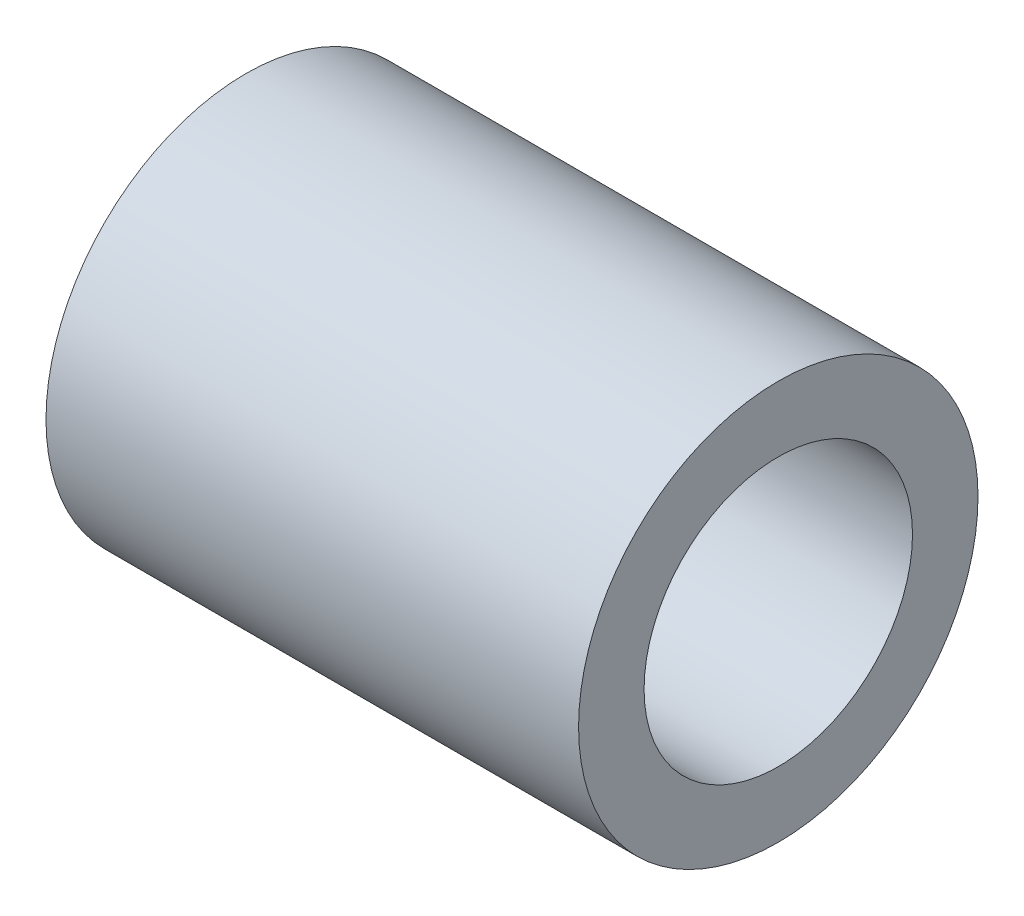
ISO-10303-21;
HEADER;
FILE_DESCRIPTION(('STEP AP214'),'2;1');
FILE_NAME('part.step','',(''),(''),'','','');
FILE_SCHEMA(('AUTOMOTIVE_DESIGN { 1 0 10303 214 1 1 1 1 }'));
ENDSEC;
DATA;
#1=APPLICATION_CONTEXT('core data for automotive mechanical design processes');
#2=APPLICATION_PROTOCOL_DEFINITION('international standard','automotive_design',2000,#1);
#3=PRODUCT_CONTEXT('',#1,'mechanical');
#4=PRODUCT('Part','Part','',(#3));
#5=PRODUCT_RELATED_PRODUCT_CATEGORY('part','',(#4));
#6=PRODUCT_DEFINITION_FORMATION('','',#4);
#7=PRODUCT_DEFINITION_CONTEXT('part definition',#1,'design');
#8=PRODUCT_DEFINITION('design','',#6,#7);
#9=PRODUCT_DEFINITION_SHAPE('','',#8);
#10=(LENGTH_UNIT() NAMED_UNIT(*) SI_UNIT(.MILLI.,.METRE.));
#11=(NAMED_UNIT(*) PLANE_ANGLE_UNIT() SI_UNIT($,.RADIAN.));
#12=(NAMED_UNIT(*) SI_UNIT($,.STERADIAN.) SOLID_ANGLE_UNIT());
#13=UNCERTAINTY_MEASURE_WITH_UNIT(LENGTH_MEASURE(1.E-05),#10,'distance_accuracy_value','');
#14=(GEOMETRIC_REPRESENTATION_CONTEXT(3) GLOBAL_UNCERTAINTY_ASSIGNED_CONTEXT((#13)) GLOBAL_UNIT_ASSIGNED_CONTEXT((#10,
#11,#12)) REPRESENTATION_CONTEXT('',''));
#15=CARTESIAN_POINT('',(0.,0.,0.));
#16=DIRECTION('',(0.,0.,1.));
#17=DIRECTION('',(1.,0.,0.));
#18=AXIS2_PLACEMENT_3D('',#15,#16,#17);
#19=CARTESIAN_POINT('',(12.7,0.,0.));
#20=DIRECTION('',(-1.,0.,0.));
#21=DIRECTION('',(0.,0.,1.));
#22=AXIS2_PLACEMENT_3D('',#19,#20,#21);
#23=CYLINDRICAL_SURFACE('',#22,4.7625);
#24=CARTESIAN_POINT('',(12.7,0.,0.));
#25=DIRECTION('',(1.,0.,0.));
#26=DIRECTION('',(0.,0.,-1.));
#27=AXIS2_PLACEMENT_3D('',#24,#25,#26);
#28=CIRCLE('',#27,4.7625);
#29=CARTESIAN_POINT('',(12.7,0.,-4.7625));
#30=VERTEX_POINT('',#29);
#31=EDGE_CURVE('E10',#30,#30,#28,.T.);
#32=ORIENTED_EDGE('',*,*,#31,.F.);
#33=EDGE_LOOP('',(#32));
#34=FACE_BOUND('',#33,.T.);
#35=CARTESIAN_POINT('',(0.,0.,0.));
#36=DIRECTION('',(1.,0.,0.));
#37=DIRECTION('',(0.,0.,-1.));
#38=AXIS2_PLACEMENT_3D('',#35,#36,#37);
#39=CIRCLE('',#38,4.7625);
#40=CARTESIAN_POINT('',(0.,0.,-4.7625));
#41=VERTEX_POINT('',#40);
#42=EDGE_CURVE('E35',#41,#41,#39,.T.);
#43=ORIENTED_EDGE('',*,*,#42,.T.);
#44=EDGE_LOOP('',(#43));
#45=FACE_BOUND('',#44,.T.);
#46=ADVANCED_FACE('F32',(#34,#45),#23,.T.);
#47=CARTESIAN_POINT('',(12.7,0.,0.));
#48=DIRECTION('',(1.,0.,0.));
#49=DIRECTION('',(0.,0.,-1.));
#50=AXIS2_PLACEMENT_3D('',#47,#48,#49);
#51=PLANE('',#50);
#52=CARTESIAN_POINT('',(12.7,0.,0.));
#53=DIRECTION('',(1.,0.,0.));
#54=DIRECTION('',(0.,0.,-1.));
#55=AXIS2_PLACEMENT_3D('',#52,#53,#54);
#56=CIRCLE('',#55,3.2004);
#57=CARTESIAN_POINT('',(12.7,0.,-3.2004));
#58=VERTEX_POINT('',#57);
#59=EDGE_CURVE('E42',#58,#58,#56,.T.);
#60=ORIENTED_EDGE('',*,*,#59,.F.);
#61=EDGE_LOOP('',(#60));
#62=FACE_BOUND('',#61,.T.);
#63=ORIENTED_EDGE('',*,*,#31,.T.);
#64=EDGE_LOOP('',(#63));
#65=FACE_BOUND('',#64,.T.);
#66=ADVANCED_FACE('F55',(#62,#65),#51,.T.);
#67=CARTESIAN_POINT('',(0.,0.,0.));
#68=DIRECTION('',(1.,0.,0.));
#69=DIRECTION('',(0.,0.,-1.));
#70=AXIS2_PLACEMENT_3D('',#67,#68,#69);
#71=PLANE('',#70);
#72=CARTESIAN_POINT('',(0.,0.,0.));
#73=DIRECTION('',(-1.,0.,0.));
#74=DIRECTION('',(0.,0.,1.));
#75=AXIS2_PLACEMENT_3D('',#72,#73,#74);
#76=CIRCLE('',#75,3.2004);
#77=CARTESIAN_POINT('',(0.,0.,3.2004));
#78=VERTEX_POINT('',#77);
#79=EDGE_CURVE('E46',#78,#78,#76,.T.);
#80=ORIENTED_EDGE('',*,*,#79,.F.);
#81=EDGE_LOOP('',(#80));
#82=FACE_BOUND('',#81,.T.);
#83=ORIENTED_EDGE('',*,*,#42,.F.);
#84=EDGE_LOOP('',(#83));
#85=FACE_BOUND('',#84,.T.);
#86=ADVANCED_FACE('F52',(#82,#85),#71,.F.);
#87=CARTESIAN_POINT('',(15.875,0.,0.));
#88=DIRECTION('',(-1.,0.,0.));
#89=DIRECTION('',(0.,0.,1.));
#90=AXIS2_PLACEMENT_3D('',#87,#88,#89);
#91=CYLINDRICAL_SURFACE('',#90,3.2004);
#92=ORIENTED_EDGE('',*,*,#59,.T.);
#93=EDGE_LOOP('',(#92));
#94=FACE_BOUND('',#93,.T.);
#95=ORIENTED_EDGE('',*,*,#79,.T.);
#96=EDGE_LOOP('',(#95));
#97=FACE_BOUND('',#96,.T.);
#98=ADVANCED_FACE('F50',(#94,#97),#91,.F.);
#99=CLOSED_SHELL('',(#46,#66,#86,#98));
#100=MANIFOLD_SOLID_BREP('B2',#99);
#101=ADVANCED_BREP_SHAPE_REPRESENTATION('',(#18,#100),#14);
#102=SHAPE_DEFINITION_REPRESENTATION(#9,#101);
ENDSEC;
END-ISO-10303-21;
